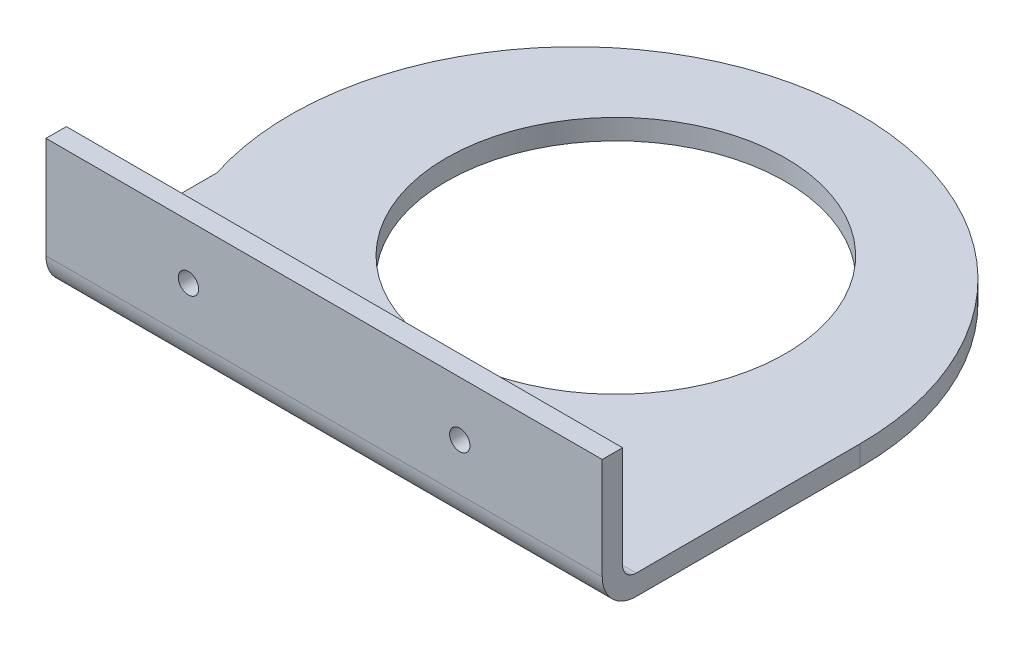
ISO-10303-21;
HEADER;
FILE_DESCRIPTION(('STEP AP214'),'2;1');
FILE_NAME('part.step','',(''),(''),'','','');
FILE_SCHEMA(('AUTOMOTIVE_DESIGN { 1 0 10303 214 1 1 1 1 }'));
ENDSEC;
DATA;
#1=APPLICATION_CONTEXT('core data for automotive mechanical design processes');
#2=APPLICATION_PROTOCOL_DEFINITION('international standard','automotive_design',2000,#1);
#3=PRODUCT_CONTEXT('',#1,'mechanical');
#4=PRODUCT('Part','Part','',(#3));
#5=PRODUCT_RELATED_PRODUCT_CATEGORY('part','',(#4));
#6=PRODUCT_DEFINITION_FORMATION('','',#4);
#7=PRODUCT_DEFINITION_CONTEXT('part definition',#1,'design');
#8=PRODUCT_DEFINITION('design','',#6,#7);
#9=PRODUCT_DEFINITION_SHAPE('','',#8);
#10=(LENGTH_UNIT() NAMED_UNIT(*) SI_UNIT(.MILLI.,.METRE.));
#11=(NAMED_UNIT(*) PLANE_ANGLE_UNIT() SI_UNIT($,.RADIAN.));
#12=(NAMED_UNIT(*) SI_UNIT($,.STERADIAN.) SOLID_ANGLE_UNIT());
#13=UNCERTAINTY_MEASURE_WITH_UNIT(LENGTH_MEASURE(1.E-05),#10,'distance_accuracy_value','');
#14=(GEOMETRIC_REPRESENTATION_CONTEXT(3) GLOBAL_UNCERTAINTY_ASSIGNED_CONTEXT((#13)) GLOBAL_UNIT_ASSIGNED_CONTEXT((#10,
#11,#12)) REPRESENTATION_CONTEXT('',''));
#15=CARTESIAN_POINT('',(0.,0.,0.));
#16=DIRECTION('',(0.,0.,1.));
#17=DIRECTION('',(1.,0.,0.));
#18=AXIS2_PLACEMENT_3D('',#15,#16,#17);
#19=CARTESIAN_POINT('',(-314.999999999971,885.999999999999,-3.));
#20=DIRECTION('',(0.,1.,0.));
#21=DIRECTION('',(-1.,0.,0.));
#22=AXIS2_PLACEMENT_3D('',#19,#20,#21);
#23=PLANE('',#22);
#24=DIRECTION('',(0.,0.,1.));
#25=VECTOR('',#24,1.);
#26=CARTESIAN_POINT('',(-272.999999999971,885.999999999999,-3.));
#27=LINE('',#26,#25);
#28=CARTESIAN_POINT('',(-272.999999999971,885.999999999999,-1.50000000000001));
#29=VERTEX_POINT('',#28);
#30=CARTESIAN_POINT('',(-272.999999999971,885.999999999999,-3.));
#31=VERTEX_POINT('',#30);
#32=EDGE_CURVE('E79',#29,#31,#27,.F.);
#33=ORIENTED_EDGE('',*,*,#32,.T.);
#34=DIRECTION('',(1.,0.,0.));
#35=VECTOR('',#34,1.);
#36=CARTESIAN_POINT('',(-314.999999999971,885.999999999999,-3.));
#37=LINE('',#36,#35);
#38=CARTESIAN_POINT('',(-313.999999999971,885.999999999999,-3.));
#39=VERTEX_POINT('',#38);
#40=EDGE_CURVE('E81',#31,#39,#37,.F.);
#41=ORIENTED_EDGE('',*,*,#40,.T.);
#42=DIRECTION('',(0.,0.,1.));
#43=VECTOR('',#42,1.);
#44=CARTESIAN_POINT('',(-313.999999999971,885.999999999999,-3.));
#45=LINE('',#44,#43);
#46=CARTESIAN_POINT('',(-313.999999999971,885.999999999999,-1.50000000000001));
#47=VERTEX_POINT('',#46);
#48=EDGE_CURVE('E89',#39,#47,#45,.T.);
#49=ORIENTED_EDGE('',*,*,#48,.T.);
#50=DIRECTION('',(1.,0.,0.));
#51=VECTOR('',#50,1.);
#52=CARTESIAN_POINT('',(-314.999999999971,885.999999999999,-1.5));
#53=LINE('',#52,#51);
#54=EDGE_CURVE('E84',#29,#47,#53,.F.);
#55=ORIENTED_EDGE('',*,*,#54,.F.);
#56=EDGE_LOOP('',(#33,#41,#49,#55));
#57=FACE_BOUND('',#56,.T.);
#58=ADVANCED_FACE('F16',(#57),#23,.T.);
#59=CARTESIAN_POINT('',(-314.999999999971,878.499999999999,-4.));
#60=DIRECTION('',(1.,0.,0.));
#61=DIRECTION('',(0.,1.,0.));
#62=AXIS2_PLACEMENT_3D('',#59,#60,#61);
#63=CYLINDRICAL_SURFACE('',#62,1.);
#64=CARTESIAN_POINT('',(-313.999999999971,878.499999999999,-4.));
#65=DIRECTION('',(1.,0.,0.));
#66=DIRECTION('',(0.,1.,0.));
#67=AXIS2_PLACEMENT_3D('',#64,#65,#66);
#68=CIRCLE('',#67,1.);
#69=CARTESIAN_POINT('',(-313.999999999971,878.499999999999,-3.));
#70=VERTEX_POINT('',#69);
#71=CARTESIAN_POINT('',(-313.999999999971,877.499999999999,-4.));
#72=VERTEX_POINT('',#71);
#73=EDGE_CURVE('E122',#70,#72,#68,.T.);
#74=ORIENTED_EDGE('',*,*,#73,.F.);
#75=DIRECTION('',(1.,0.,0.));
#76=VECTOR('',#75,1.);
#77=CARTESIAN_POINT('',(-314.999999999971,878.499999999999,-3.));
#78=LINE('',#77,#76);
#79=CARTESIAN_POINT('',(-272.999999999971,878.499999999999,-3.));
#80=VERTEX_POINT('',#79);
#81=EDGE_CURVE('E98',#70,#80,#78,.T.);
#82=ORIENTED_EDGE('',*,*,#81,.T.);
#83=CARTESIAN_POINT('',(-272.999999999971,878.499999999999,-4.));
#84=DIRECTION('',(1.,0.,0.));
#85=DIRECTION('',(0.,1.,0.));
#86=AXIS2_PLACEMENT_3D('',#83,#84,#85);
#87=CIRCLE('',#86,1.);
#88=CARTESIAN_POINT('',(-272.999999999971,877.499999999999,-4.));
#89=VERTEX_POINT('',#88);
#90=EDGE_CURVE('E88',#89,#80,#87,.F.);
#91=ORIENTED_EDGE('',*,*,#90,.F.);
#92=DIRECTION('',(1.,0.,0.));
#93=VECTOR('',#92,1.);
#94=CARTESIAN_POINT('',(-314.999999999971,877.499999999999,-4.));
#95=LINE('',#94,#93);
#96=EDGE_CURVE('E108',#89,#72,#95,.F.);
#97=ORIENTED_EDGE('',*,*,#96,.T.);
#98=EDGE_LOOP('',(#74,#82,#91,#97));
#99=FACE_BOUND('',#98,.T.);
#100=ADVANCED_FACE('F202',(#99),#63,.F.);
#101=CARTESIAN_POINT('',(-314.999999999971,885.999999999999,-1.5));
#102=DIRECTION('',(0.,0.,1.));
#103=DIRECTION('',(0.,-1.,0.));
#104=AXIS2_PLACEMENT_3D('',#101,#102,#103);
#105=PLANE('',#104);
#106=CARTESIAN_POINT('',(-283.499999999971,881.999999999999,-1.5));
#107=DIRECTION('',(0.,0.,1.));
#108=DIRECTION('',(0.,-1.,0.));
#109=AXIS2_PLACEMENT_3D('',#106,#107,#108);
#110=CIRCLE('',#109,0.749999999999969);
#111=CARTESIAN_POINT('',(-283.499999999971,881.249999999999,-1.5));
#112=VERTEX_POINT('',#111);
#113=EDGE_CURVE('E150',#112,#112,#110,.T.);
#114=ORIENTED_EDGE('',*,*,#113,.F.);
#115=EDGE_LOOP('',(#114));
#116=FACE_BOUND('',#115,.T.);
#117=CARTESIAN_POINT('',(-303.499999999971,881.999999999999,-1.5));
#118=DIRECTION('',(0.,0.,1.));
#119=DIRECTION('',(0.,-1.,0.));
#120=AXIS2_PLACEMENT_3D('',#117,#118,#119);
#121=CIRCLE('',#120,0.749999999999969);
#122=CARTESIAN_POINT('',(-303.499999999971,881.249999999999,-1.5));
#123=VERTEX_POINT('',#122);
#124=EDGE_CURVE('E166',#123,#123,#121,.T.);
#125=ORIENTED_EDGE('',*,*,#124,.F.);
#126=EDGE_LOOP('',(#125));
#127=FACE_BOUND('',#126,.T.);
#128=DIRECTION('',(0.,1.,0.));
#129=VECTOR('',#128,1.);
#130=CARTESIAN_POINT('',(-272.999999999971,878.499999999999,-1.50000000000003));
#131=LINE('',#130,#129);
#132=CARTESIAN_POINT('',(-272.999999999971,878.499999999999,-1.50000000000004));
#133=VERTEX_POINT('',#132);
#134=EDGE_CURVE('E104',#133,#29,#131,.T.);
#135=ORIENTED_EDGE('',*,*,#134,.T.);
#136=ORIENTED_EDGE('',*,*,#54,.T.);
#137=DIRECTION('',(0.,1.,0.));
#138=VECTOR('',#137,1.);
#139=CARTESIAN_POINT('',(-313.999999999971,878.499999999999,-1.50000000000003));
#140=LINE('',#139,#138);
#141=CARTESIAN_POINT('',(-313.999999999971,878.499999999999,-1.50000000000006));
#142=VERTEX_POINT('',#141);
#143=EDGE_CURVE('E148',#142,#47,#140,.T.);
#144=ORIENTED_EDGE('',*,*,#143,.F.);
#145=DIRECTION('',(1.,0.,0.));
#146=VECTOR('',#145,1.);
#147=CARTESIAN_POINT('',(-314.999999999971,878.499999999999,-1.50000000000006));
#148=LINE('',#147,#146);
#149=EDGE_CURVE('E125',#133,#142,#148,.F.);
#150=ORIENTED_EDGE('',*,*,#149,.F.);
#151=EDGE_LOOP('',(#135,#136,#144,#150));
#152=FACE_BOUND('',#151,.T.);
#153=ADVANCED_FACE('F181',(#116,#127,#152),#105,.T.);
#154=CARTESIAN_POINT('',(-314.999999999971,885.999999999999,-3.));
#155=DIRECTION('',(0.,0.,1.));
#156=DIRECTION('',(0.,-1.,0.));
#157=AXIS2_PLACEMENT_3D('',#154,#155,#156);
#158=PLANE('',#157);
#159=CARTESIAN_POINT('',(-283.499999999971,881.999999999999,-3.));
#160=DIRECTION('',(0.,0.,-1.));
#161=DIRECTION('',(0.,1.,0.));
#162=AXIS2_PLACEMENT_3D('',#159,#160,#161);
#163=CIRCLE('',#162,0.749999999999969);
#164=CARTESIAN_POINT('',(-283.499999999971,882.749999999999,-3.));
#165=VERTEX_POINT('',#164);
#166=EDGE_CURVE('E169',#165,#165,#163,.T.);
#167=ORIENTED_EDGE('',*,*,#166,.F.);
#168=EDGE_LOOP('',(#167));
#169=FACE_BOUND('',#168,.T.);
#170=CARTESIAN_POINT('',(-303.499999999971,881.999999999999,-3.));
#171=DIRECTION('',(0.,0.,-1.));
#172=DIRECTION('',(0.,-1.,0.));
#173=AXIS2_PLACEMENT_3D('',#170,#171,#172);
#174=CIRCLE('',#173,0.749999999999969);
#175=CARTESIAN_POINT('',(-303.499999999971,881.249999999999,-3.));
#176=VERTEX_POINT('',#175);
#177=EDGE_CURVE('E170',#176,#176,#174,.T.);
#178=ORIENTED_EDGE('',*,*,#177,.F.);
#179=EDGE_LOOP('',(#178));
#180=FACE_BOUND('',#179,.T.);
#181=DIRECTION('',(0.,1.,0.));
#182=VECTOR('',#181,1.);
#183=CARTESIAN_POINT('',(-313.999999999971,878.499999999999,-3.));
#184=LINE('',#183,#182);
#185=EDGE_CURVE('E97',#39,#70,#184,.F.);
#186=ORIENTED_EDGE('',*,*,#185,.F.);
#187=ORIENTED_EDGE('',*,*,#40,.F.);
#188=DIRECTION('',(0.,1.,0.));
#189=VECTOR('',#188,1.);
#190=CARTESIAN_POINT('',(-272.999999999971,878.499999999999,-3.));
#191=LINE('',#190,#189);
#192=EDGE_CURVE('E95',#31,#80,#191,.F.);
#193=ORIENTED_EDGE('',*,*,#192,.T.);
#194=ORIENTED_EDGE('',*,*,#81,.F.);
#195=EDGE_LOOP('',(#186,#187,#193,#194));
#196=FACE_BOUND('',#195,.T.);
#197=ADVANCED_FACE('F93',(#169,#180,#196),#158,.F.);
#198=CARTESIAN_POINT('',(-314.999999999971,877.499999999999,-1.5));
#199=DIRECTION('',(0.,-1.,0.));
#200=DIRECTION('',(1.,0.,0.));
#201=AXIS2_PLACEMENT_3D('',#198,#199,#200);
#202=PLANE('',#201);
#203=CARTESIAN_POINT('',(-293.999999999972,877.499999999999,-23.5));
#204=DIRECTION('',(0.,1.,0.));
#205=DIRECTION('',(-1.,0.,0.));
#206=AXIS2_PLACEMENT_3D('',#203,#204,#205);
#207=CIRCLE('',#206,12.5);
#208=CARTESIAN_POINT('',(-306.499999999972,877.499999999999,-23.5));
#209=VERTEX_POINT('',#208);
#210=EDGE_CURVE('E133',#209,#209,#207,.F.);
#211=ORIENTED_EDGE('',*,*,#210,.T.);
#212=EDGE_LOOP('',(#211));
#213=FACE_BOUND('',#212,.T.);
#214=DIRECTION('',(0.,0.,1.));
#215=VECTOR('',#214,1.);
#216=CARTESIAN_POINT('',(-313.999999999971,877.499999999999,-3.));
#217=LINE('',#216,#215);
#218=CARTESIAN_POINT('',(-313.999999999971,877.499999999999,-14.096875762567));
#219=VERTEX_POINT('',#218);
#220=EDGE_CURVE('E143',#72,#219,#217,.F.);
#221=ORIENTED_EDGE('',*,*,#220,.F.);
#222=ORIENTED_EDGE('',*,*,#96,.F.);
#223=DIRECTION('',(0.,0.,1.));
#224=VECTOR('',#223,1.);
#225=CARTESIAN_POINT('',(-272.999999999971,877.499999999999,-4.));
#226=LINE('',#225,#224);
#227=CARTESIAN_POINT('',(-272.999999999971,877.499999999999,-20.5));
#228=VERTEX_POINT('',#227);
#229=EDGE_CURVE('E103',#89,#228,#226,.F.);
#230=ORIENTED_EDGE('',*,*,#229,.T.);
#231=CARTESIAN_POINT('',(-293.999999999972,877.499999999999,-20.5));
#232=DIRECTION('',(0.,1.,0.));
#233=DIRECTION('',(0.,0.,1.));
#234=AXIS2_PLACEMENT_3D('',#231,#232,#233);
#235=CIRCLE('',#234,21.);
#236=EDGE_CURVE('E137',#219,#228,#235,.F.);
#237=ORIENTED_EDGE('',*,*,#236,.F.);
#238=EDGE_LOOP('',(#221,#222,#230,#237));
#239=FACE_BOUND('',#238,.T.);
#240=ADVANCED_FACE('F180',(#213,#239),#202,.F.);
#241=CARTESIAN_POINT('',(-272.999999999971,878.499999999999,-4.));
#242=DIRECTION('',(-1.,0.,0.));
#243=DIRECTION('',(0.,0.,1.));
#244=AXIS2_PLACEMENT_3D('',#241,#242,#243);
#245=PLANE('',#244);
#246=ORIENTED_EDGE('',*,*,#229,.F.);
#247=ORIENTED_EDGE('',*,*,#90,.T.);
#248=ORIENTED_EDGE('',*,*,#192,.F.);
#249=ORIENTED_EDGE('',*,*,#32,.F.);
#250=ORIENTED_EDGE('',*,*,#134,.F.);
#251=CARTESIAN_POINT('',(-272.999999999971,878.499999999999,-4.));
#252=DIRECTION('',(1.,0.,0.));
#253=DIRECTION('',(0.,1.,0.));
#254=AXIS2_PLACEMENT_3D('',#251,#252,#253);
#255=CIRCLE('',#254,2.49999999999995);
#256=CARTESIAN_POINT('',(-272.999999999971,875.999999999999,-4.));
#257=VERTEX_POINT('',#256);
#258=EDGE_CURVE('E106',#257,#133,#255,.F.);
#259=ORIENTED_EDGE('',*,*,#258,.F.);
#260=DIRECTION('',(0.,0.,1.));
#261=VECTOR('',#260,1.);
#262=CARTESIAN_POINT('',(-272.999999999971,875.999999999999,-1.5));
#263=LINE('',#262,#261);
#264=CARTESIAN_POINT('',(-272.999999999971,875.999999999999,-20.5));
#265=VERTEX_POINT('',#264);
#266=EDGE_CURVE('E136',#265,#257,#263,.T.);
#267=ORIENTED_EDGE('',*,*,#266,.F.);
#268=DIRECTION('',(0.,1.,0.));
#269=VECTOR('',#268,1.);
#270=CARTESIAN_POINT('',(-272.999999999971,877.499999999999,-20.5));
#271=LINE('',#270,#269);
#272=EDGE_CURVE('E145',#228,#265,#271,.F.);
#273=ORIENTED_EDGE('',*,*,#272,.F.);
#274=EDGE_LOOP('',(#246,#247,#248,#249,#250,#259,#267,#273));
#275=FACE_BOUND('',#274,.T.);
#276=ADVANCED_FACE('F101',(#275),#245,.F.);
#277=CARTESIAN_POINT('',(-314.999999999971,878.499999999999,-4.));
#278=DIRECTION('',(1.,0.,0.));
#279=DIRECTION('',(0.,1.,0.));
#280=AXIS2_PLACEMENT_3D('',#277,#278,#279);
#281=CYLINDRICAL_SURFACE('',#280,2.49999999999995);
#282=ORIENTED_EDGE('',*,*,#258,.T.);
#283=ORIENTED_EDGE('',*,*,#149,.T.);
#284=CARTESIAN_POINT('',(-313.999999999971,878.499999999999,-4.));
#285=DIRECTION('',(1.,0.,0.));
#286=DIRECTION('',(0.,1.,0.));
#287=AXIS2_PLACEMENT_3D('',#284,#285,#286);
#288=CIRCLE('',#287,2.49999999999995);
#289=CARTESIAN_POINT('',(-313.999999999971,875.999999999999,-4.));
#290=VERTEX_POINT('',#289);
#291=EDGE_CURVE('E126',#290,#142,#288,.F.);
#292=ORIENTED_EDGE('',*,*,#291,.F.);
#293=DIRECTION('',(1.,0.,0.));
#294=VECTOR('',#293,1.);
#295=CARTESIAN_POINT('',(-314.999999999971,875.999999999999,-4.));
#296=LINE('',#295,#294);
#297=EDGE_CURVE('E155',#257,#290,#296,.F.);
#298=ORIENTED_EDGE('',*,*,#297,.F.);
#299=EDGE_LOOP('',(#282,#283,#292,#298));
#300=FACE_BOUND('',#299,.T.);
#301=ADVANCED_FACE('F218',(#300),#281,.T.);
#302=CARTESIAN_POINT('',(-313.999999999971,878.499999999999,-3.));
#303=DIRECTION('',(-1.,0.,0.));
#304=DIRECTION('',(0.,0.,1.));
#305=AXIS2_PLACEMENT_3D('',#302,#303,#304);
#306=PLANE('',#305);
#307=ORIENTED_EDGE('',*,*,#220,.T.);
#308=DIRECTION('',(0.,1.,0.));
#309=VECTOR('',#308,1.);
#310=CARTESIAN_POINT('',(-313.999999999971,876.749999999999,-14.096875762567));
#311=LINE('',#310,#309);
#312=CARTESIAN_POINT('',(-313.999999999971,875.999999999999,-14.096875762567));
#313=VERTEX_POINT('',#312);
#314=EDGE_CURVE('E20',#313,#219,#311,.T.);
#315=ORIENTED_EDGE('',*,*,#314,.F.);
#316=DIRECTION('',(0.,0.,1.));
#317=VECTOR('',#316,1.);
#318=CARTESIAN_POINT('',(-313.999999999971,875.999999999999,-1.5));
#319=LINE('',#318,#317);
#320=EDGE_CURVE('E132',#290,#313,#319,.F.);
#321=ORIENTED_EDGE('',*,*,#320,.F.);
#322=ORIENTED_EDGE('',*,*,#291,.T.);
#323=ORIENTED_EDGE('',*,*,#143,.T.);
#324=ORIENTED_EDGE('',*,*,#48,.F.);
#325=ORIENTED_EDGE('',*,*,#185,.T.);
#326=ORIENTED_EDGE('',*,*,#73,.T.);
#327=EDGE_LOOP('',(#307,#315,#321,#322,#323,#324,#325,#326));
#328=FACE_BOUND('',#327,.T.);
#329=ADVANCED_FACE('F18',(#328),#306,.T.);
#330=CARTESIAN_POINT('',(-293.999999999972,877.499999999999,-20.5));
#331=DIRECTION('',(0.,1.,0.));
#332=DIRECTION('',(0.,0.,1.));
#333=AXIS2_PLACEMENT_3D('',#330,#331,#332);
#334=CYLINDRICAL_SURFACE('',#333,21.);
#335=ORIENTED_EDGE('',*,*,#314,.T.);
#336=ORIENTED_EDGE('',*,*,#236,.T.);
#337=ORIENTED_EDGE('',*,*,#272,.T.);
#338=CARTESIAN_POINT('',(-293.999999999972,875.999999999999,-20.5));
#339=DIRECTION('',(0.,1.,0.));
#340=DIRECTION('',(0.,0.,1.));
#341=AXIS2_PLACEMENT_3D('',#338,#339,#340);
#342=CIRCLE('',#341,21.);
#343=EDGE_CURVE('E26',#313,#265,#342,.F.);
#344=ORIENTED_EDGE('',*,*,#343,.F.);
#345=EDGE_LOOP('',(#335,#336,#337,#344));
#346=FACE_BOUND('',#345,.T.);
#347=ADVANCED_FACE('F222',(#346),#334,.T.);
#348=CARTESIAN_POINT('',(-293.999999999972,875.499999999999,-23.5));
#349=DIRECTION('',(0.,1.,0.));
#350=DIRECTION('',(-1.,0.,0.));
#351=AXIS2_PLACEMENT_3D('',#348,#349,#350);
#352=CYLINDRICAL_SURFACE('',#351,12.5);
#353=ORIENTED_EDGE('',*,*,#210,.F.);
#354=EDGE_LOOP('',(#353));
#355=FACE_BOUND('',#354,.T.);
#356=CARTESIAN_POINT('',(-293.999999999972,875.999999999999,-23.5));
#357=DIRECTION('',(0.,1.,0.));
#358=DIRECTION('',(-1.,0.,0.));
#359=AXIS2_PLACEMENT_3D('',#356,#357,#358);
#360=CIRCLE('',#359,12.5);
#361=CARTESIAN_POINT('',(-306.499999999972,875.999999999999,-23.5));
#362=VERTEX_POINT('',#361);
#363=EDGE_CURVE('E11',#362,#362,#360,.T.);
#364=ORIENTED_EDGE('',*,*,#363,.F.);
#365=EDGE_LOOP('',(#364));
#366=FACE_BOUND('',#365,.T.);
#367=ADVANCED_FACE('F198',(#355,#366),#352,.F.);
#368=CARTESIAN_POINT('',(-314.999999999971,875.999999999999,-1.5));
#369=DIRECTION('',(0.,-1.,0.));
#370=DIRECTION('',(1.,0.,0.));
#371=AXIS2_PLACEMENT_3D('',#368,#369,#370);
#372=PLANE('',#371);
#373=ORIENTED_EDGE('',*,*,#363,.T.);
#374=EDGE_LOOP('',(#373));
#375=FACE_BOUND('',#374,.T.);
#376=ORIENTED_EDGE('',*,*,#320,.T.);
#377=ORIENTED_EDGE('',*,*,#343,.T.);
#378=ORIENTED_EDGE('',*,*,#266,.T.);
#379=ORIENTED_EDGE('',*,*,#297,.T.);
#380=EDGE_LOOP('',(#376,#377,#378,#379));
#381=FACE_BOUND('',#380,.T.);
#382=ADVANCED_FACE('F187',(#375,#381),#372,.T.);
#383=CARTESIAN_POINT('',(-303.499999999971,881.999999999999,17.));
#384=DIRECTION('',(0.,0.,-1.));
#385=DIRECTION('',(0.,1.,0.));
#386=AXIS2_PLACEMENT_3D('',#383,#384,#385);
#387=CYLINDRICAL_SURFACE('',#386,0.749999999999969);
#388=ORIENTED_EDGE('',*,*,#124,.T.);
#389=EDGE_LOOP('',(#388));
#390=FACE_BOUND('',#389,.T.);
#391=ORIENTED_EDGE('',*,*,#177,.T.);
#392=EDGE_LOOP('',(#391));
#393=FACE_BOUND('',#392,.T.);
#394=ADVANCED_FACE('F185',(#390,#393),#387,.F.);
#395=CARTESIAN_POINT('',(-283.499999999971,881.999999999999,17.));
#396=DIRECTION('',(0.,0.,-1.));
#397=DIRECTION('',(0.,1.,0.));
#398=AXIS2_PLACEMENT_3D('',#395,#396,#397);
#399=CYLINDRICAL_SURFACE('',#398,0.749999999999969);
#400=ORIENTED_EDGE('',*,*,#113,.T.);
#401=EDGE_LOOP('',(#400));
#402=FACE_BOUND('',#401,.T.);
#403=ORIENTED_EDGE('',*,*,#166,.T.);
#404=EDGE_LOOP('',(#403));
#405=FACE_BOUND('',#404,.T.);
#406=ADVANCED_FACE('F176',(#402,#405),#399,.F.);
#407=CLOSED_SHELL('',(#58,#100,#153,#197,#240,#276,#301,#329,#347,#367,#382,#394,#406));
#408=MANIFOLD_SOLID_BREP('B1',#407);
#409=ADVANCED_BREP_SHAPE_REPRESENTATION('',(#18,#408),#14);
#410=SHAPE_DEFINITION_REPRESENTATION(#9,#409);
ENDSEC;
END-ISO-10303-21;
